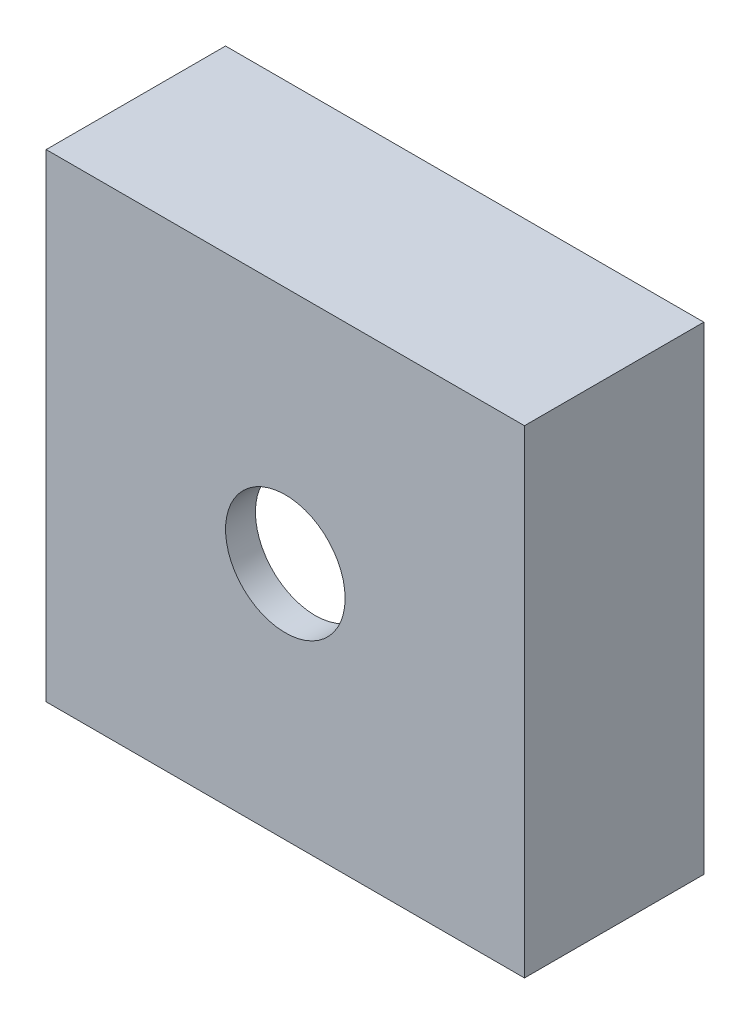
ISO-10303-21;
HEADER;
FILE_DESCRIPTION(('STEP AP214'),'2;1');
FILE_NAME('part.step','',(''),(''),'','','');
FILE_SCHEMA(('AUTOMOTIVE_DESIGN { 1 0 10303 214 1 1 1 1 }'));
ENDSEC;
DATA;
#1=APPLICATION_CONTEXT('core data for automotive mechanical design processes');
#2=APPLICATION_PROTOCOL_DEFINITION('international standard','automotive_design',2000,#1);
#3=PRODUCT_CONTEXT('',#1,'mechanical');
#4=PRODUCT('Part','Part','',(#3));
#5=PRODUCT_RELATED_PRODUCT_CATEGORY('part','',(#4));
#6=PRODUCT_DEFINITION_FORMATION('','',#4);
#7=PRODUCT_DEFINITION_CONTEXT('part definition',#1,'design');
#8=PRODUCT_DEFINITION('design','',#6,#7);
#9=PRODUCT_DEFINITION_SHAPE('','',#8);
#10=(LENGTH_UNIT() NAMED_UNIT(*) SI_UNIT(.MILLI.,.METRE.));
#11=(NAMED_UNIT(*) PLANE_ANGLE_UNIT() SI_UNIT($,.RADIAN.));
#12=(NAMED_UNIT(*) SI_UNIT($,.STERADIAN.) SOLID_ANGLE_UNIT());
#13=UNCERTAINTY_MEASURE_WITH_UNIT(LENGTH_MEASURE(1.E-05),#10,'distance_accuracy_value','');
#14=(GEOMETRIC_REPRESENTATION_CONTEXT(3) GLOBAL_UNCERTAINTY_ASSIGNED_CONTEXT((#13)) GLOBAL_UNIT_ASSIGNED_CONTEXT((#10,
#11,#12)) REPRESENTATION_CONTEXT('',''));
#15=CARTESIAN_POINT('',(0.,0.,0.));
#16=DIRECTION('',(0.,0.,1.));
#17=DIRECTION('',(1.,0.,0.));
#18=AXIS2_PLACEMENT_3D('',#15,#16,#17);
#19=CARTESIAN_POINT('',(0.,0.,0.));
#20=DIRECTION('',(0.,0.,-1.));
#21=DIRECTION('',(-1.,0.,0.));
#22=AXIS2_PLACEMENT_3D('',#19,#20,#21);
#23=PLANE('',#22);
#24=DIRECTION('',(0.,1.,0.));
#25=VECTOR('',#24,1.);
#26=CARTESIAN_POINT('',(40.,-40.,0.));
#27=LINE('',#26,#25);
#28=CARTESIAN_POINT('',(40.,-40.,0.));
#29=VERTEX_POINT('',#28);
#30=CARTESIAN_POINT('',(40.,40.,0.));
#31=VERTEX_POINT('',#30);
#32=EDGE_CURVE('E131',#29,#31,#27,.T.);
#33=ORIENTED_EDGE('',*,*,#32,.F.);
#34=DIRECTION('',(1.,0.,0.));
#35=VECTOR('',#34,1.);
#36=CARTESIAN_POINT('',(-40.,-40.,0.));
#37=LINE('',#36,#35);
#38=CARTESIAN_POINT('',(-40.,-40.,0.));
#39=VERTEX_POINT('',#38);
#40=EDGE_CURVE('E79',#39,#29,#37,.T.);
#41=ORIENTED_EDGE('',*,*,#40,.F.);
#42=DIRECTION('',(0.,-1.,0.));
#43=VECTOR('',#42,1.);
#44=CARTESIAN_POINT('',(-40.,-40.,0.));
#45=LINE('',#44,#43);
#46=CARTESIAN_POINT('',(-40.,40.,0.));
#47=VERTEX_POINT('',#46);
#48=EDGE_CURVE('E161',#47,#39,#45,.T.);
#49=ORIENTED_EDGE('',*,*,#48,.F.);
#50=DIRECTION('',(-1.,0.,0.));
#51=VECTOR('',#50,1.);
#52=CARTESIAN_POINT('',(-40.,40.,0.));
#53=LINE('',#52,#51);
#54=EDGE_CURVE('E135',#31,#47,#53,.T.);
#55=ORIENTED_EDGE('',*,*,#54,.F.);
#56=EDGE_LOOP('',(#33,#41,#49,#55));
#57=FACE_BOUND('',#56,.T.);
#58=DIRECTION('',(1.,0.,0.));
#59=VECTOR('',#58,1.);
#60=CARTESIAN_POINT('',(0.,-35.,0.));
#61=LINE('',#60,#59);
#62=CARTESIAN_POINT('',(-35.,-35.,0.));
#63=VERTEX_POINT('',#62);
#64=CARTESIAN_POINT('',(35.,-35.,0.));
#65=VERTEX_POINT('',#64);
#66=EDGE_CURVE('E126',#63,#65,#61,.T.);
#67=ORIENTED_EDGE('',*,*,#66,.T.);
#68=DIRECTION('',(0.,1.,0.));
#69=VECTOR('',#68,1.);
#70=CARTESIAN_POINT('',(35.,0.,0.));
#71=LINE('',#70,#69);
#72=CARTESIAN_POINT('',(35.,35.,0.));
#73=VERTEX_POINT('',#72);
#74=EDGE_CURVE('E147',#65,#73,#71,.T.);
#75=ORIENTED_EDGE('',*,*,#74,.T.);
#76=DIRECTION('',(-1.,0.,0.));
#77=VECTOR('',#76,1.);
#78=CARTESIAN_POINT('',(0.,35.,0.));
#79=LINE('',#78,#77);
#80=CARTESIAN_POINT('',(-35.,35.,0.));
#81=VERTEX_POINT('',#80);
#82=EDGE_CURVE('E130',#73,#81,#79,.T.);
#83=ORIENTED_EDGE('',*,*,#82,.T.);
#84=DIRECTION('',(0.,-1.,0.));
#85=VECTOR('',#84,1.);
#86=CARTESIAN_POINT('',(-35.,0.,0.));
#87=LINE('',#86,#85);
#88=EDGE_CURVE('E49',#81,#63,#87,.T.);
#89=ORIENTED_EDGE('',*,*,#88,.T.);
#90=EDGE_LOOP('',(#67,#75,#83,#89));
#91=FACE_BOUND('',#90,.T.);
#92=ADVANCED_FACE('F33',(#57,#91),#23,.T.);
#93=CARTESIAN_POINT('',(40.,-40.,30.));
#94=DIRECTION('',(-1.,0.,0.));
#95=DIRECTION('',(0.,0.,1.));
#96=AXIS2_PLACEMENT_3D('',#93,#94,#95);
#97=PLANE('',#96);
#98=ORIENTED_EDGE('',*,*,#32,.T.);
#99=DIRECTION('',(0.,0.,-1.));
#100=VECTOR('',#99,1.);
#101=CARTESIAN_POINT('',(40.,40.,30.));
#102=LINE('',#101,#100);
#103=CARTESIAN_POINT('',(40.,40.,30.));
#104=VERTEX_POINT('',#103);
#105=EDGE_CURVE('E11',#104,#31,#102,.T.);
#106=ORIENTED_EDGE('',*,*,#105,.F.);
#107=DIRECTION('',(0.,1.,0.));
#108=VECTOR('',#107,1.);
#109=CARTESIAN_POINT('',(40.,-40.,30.));
#110=LINE('',#109,#108);
#111=CARTESIAN_POINT('',(40.,-40.,30.));
#112=VERTEX_POINT('',#111);
#113=EDGE_CURVE('E153',#112,#104,#110,.T.);
#114=ORIENTED_EDGE('',*,*,#113,.F.);
#115=DIRECTION('',(0.,0.,-1.));
#116=VECTOR('',#115,1.);
#117=CARTESIAN_POINT('',(40.,-40.,30.));
#118=LINE('',#117,#116);
#119=EDGE_CURVE('E158',#112,#29,#118,.T.);
#120=ORIENTED_EDGE('',*,*,#119,.T.);
#121=EDGE_LOOP('',(#98,#106,#114,#120));
#122=FACE_BOUND('',#121,.T.);
#123=ADVANCED_FACE('F35',(#122),#97,.F.);
#124=CARTESIAN_POINT('',(-40.,40.,30.));
#125=DIRECTION('',(0.,-1.,0.));
#126=DIRECTION('',(0.,0.,-1.));
#127=AXIS2_PLACEMENT_3D('',#124,#125,#126);
#128=PLANE('',#127);
#129=ORIENTED_EDGE('',*,*,#54,.T.);
#130=DIRECTION('',(0.,0.,-1.));
#131=VECTOR('',#130,1.);
#132=CARTESIAN_POINT('',(-40.,40.,30.));
#133=LINE('',#132,#131);
#134=CARTESIAN_POINT('',(-40.,40.,30.));
#135=VERTEX_POINT('',#134);
#136=EDGE_CURVE('E42',#135,#47,#133,.T.);
#137=ORIENTED_EDGE('',*,*,#136,.F.);
#138=DIRECTION('',(-1.,0.,0.));
#139=VECTOR('',#138,1.);
#140=CARTESIAN_POINT('',(-40.,40.,30.));
#141=LINE('',#140,#139);
#142=EDGE_CURVE('E86',#104,#135,#141,.T.);
#143=ORIENTED_EDGE('',*,*,#142,.F.);
#144=ORIENTED_EDGE('',*,*,#105,.T.);
#145=EDGE_LOOP('',(#129,#137,#143,#144));
#146=FACE_BOUND('',#145,.T.);
#147=ADVANCED_FACE('F189',(#146),#128,.F.);
#148=CARTESIAN_POINT('',(-40.,-40.,30.));
#149=DIRECTION('',(1.,0.,0.));
#150=DIRECTION('',(0.,0.,-1.));
#151=AXIS2_PLACEMENT_3D('',#148,#149,#150);
#152=PLANE('',#151);
#153=ORIENTED_EDGE('',*,*,#48,.T.);
#154=DIRECTION('',(0.,0.,-1.));
#155=VECTOR('',#154,1.);
#156=CARTESIAN_POINT('',(-40.,-40.,30.));
#157=LINE('',#156,#155);
#158=CARTESIAN_POINT('',(-40.,-40.,30.));
#159=VERTEX_POINT('',#158);
#160=EDGE_CURVE('E165',#159,#39,#157,.T.);
#161=ORIENTED_EDGE('',*,*,#160,.F.);
#162=DIRECTION('',(0.,-1.,0.));
#163=VECTOR('',#162,1.);
#164=CARTESIAN_POINT('',(-40.,-40.,30.));
#165=LINE('',#164,#163);
#166=EDGE_CURVE('E156',#135,#159,#165,.T.);
#167=ORIENTED_EDGE('',*,*,#166,.F.);
#168=ORIENTED_EDGE('',*,*,#136,.T.);
#169=EDGE_LOOP('',(#153,#161,#167,#168));
#170=FACE_BOUND('',#169,.T.);
#171=ADVANCED_FACE('F171',(#170),#152,.F.);
#172=CARTESIAN_POINT('',(-40.,-40.,30.));
#173=DIRECTION('',(0.,1.,0.));
#174=DIRECTION('',(0.,0.,1.));
#175=AXIS2_PLACEMENT_3D('',#172,#173,#174);
#176=PLANE('',#175);
#177=ORIENTED_EDGE('',*,*,#40,.T.);
#178=ORIENTED_EDGE('',*,*,#119,.F.);
#179=DIRECTION('',(1.,0.,0.));
#180=VECTOR('',#179,1.);
#181=CARTESIAN_POINT('',(-40.,-40.,30.));
#182=LINE('',#181,#180);
#183=EDGE_CURVE('E58',#159,#112,#182,.T.);
#184=ORIENTED_EDGE('',*,*,#183,.F.);
#185=ORIENTED_EDGE('',*,*,#160,.T.);
#186=EDGE_LOOP('',(#177,#178,#184,#185));
#187=FACE_BOUND('',#186,.T.);
#188=ADVANCED_FACE('F179',(#187),#176,.F.);
#189=CARTESIAN_POINT('',(0.,0.,30.));
#190=DIRECTION('',(0.,0.,-1.));
#191=DIRECTION('',(-1.,0.,0.));
#192=AXIS2_PLACEMENT_3D('',#189,#190,#191);
#193=PLANE('',#192);
#194=CARTESIAN_POINT('',(0.,0.,30.));
#195=DIRECTION('',(0.,0.,1.));
#196=DIRECTION('',(1.,0.,0.));
#197=AXIS2_PLACEMENT_3D('',#194,#195,#196);
#198=CIRCLE('',#197,10.);
#199=CARTESIAN_POINT('',(10.,0.,30.));
#200=VERTEX_POINT('',#199);
#201=EDGE_CURVE('E140',#200,#200,#198,.T.);
#202=ORIENTED_EDGE('',*,*,#201,.F.);
#203=EDGE_LOOP('',(#202));
#204=FACE_BOUND('',#203,.T.);
#205=ORIENTED_EDGE('',*,*,#113,.T.);
#206=ORIENTED_EDGE('',*,*,#142,.T.);
#207=ORIENTED_EDGE('',*,*,#166,.T.);
#208=ORIENTED_EDGE('',*,*,#183,.T.);
#209=EDGE_LOOP('',(#205,#206,#207,#208));
#210=FACE_BOUND('',#209,.T.);
#211=ADVANCED_FACE('F181',(#204,#210),#193,.F.);
#212=CARTESIAN_POINT('',(35.,-40.,30.));
#213=DIRECTION('',(-1.,0.,0.));
#214=DIRECTION('',(0.,0.,1.));
#215=AXIS2_PLACEMENT_3D('',#212,#213,#214);
#216=PLANE('',#215);
#217=ORIENTED_EDGE('',*,*,#74,.F.);
#218=DIRECTION('',(0.,0.,-1.));
#219=VECTOR('',#218,1.);
#220=CARTESIAN_POINT('',(35.,-35.,30.));
#221=LINE('',#220,#219);
#222=CARTESIAN_POINT('',(35.,-35.,25.));
#223=VERTEX_POINT('',#222);
#224=EDGE_CURVE('E125',#223,#65,#221,.T.);
#225=ORIENTED_EDGE('',*,*,#224,.F.);
#226=DIRECTION('',(0.,1.,0.));
#227=VECTOR('',#226,1.);
#228=CARTESIAN_POINT('',(35.,0.,25.));
#229=LINE('',#228,#227);
#230=CARTESIAN_POINT('',(35.,35.,25.));
#231=VERTEX_POINT('',#230);
#232=EDGE_CURVE('E113',#223,#231,#229,.T.);
#233=ORIENTED_EDGE('',*,*,#232,.T.);
#234=DIRECTION('',(0.,0.,-1.));
#235=VECTOR('',#234,1.);
#236=CARTESIAN_POINT('',(35.,35.,30.));
#237=LINE('',#236,#235);
#238=EDGE_CURVE('E123',#231,#73,#237,.T.);
#239=ORIENTED_EDGE('',*,*,#238,.T.);
#240=EDGE_LOOP('',(#217,#225,#233,#239));
#241=FACE_BOUND('',#240,.T.);
#242=ADVANCED_FACE('F122',(#241),#216,.T.);
#243=CARTESIAN_POINT('',(-40.,35.,30.));
#244=DIRECTION('',(0.,-1.,0.));
#245=DIRECTION('',(0.,0.,-1.));
#246=AXIS2_PLACEMENT_3D('',#243,#244,#245);
#247=PLANE('',#246);
#248=ORIENTED_EDGE('',*,*,#82,.F.);
#249=ORIENTED_EDGE('',*,*,#238,.F.);
#250=DIRECTION('',(-1.,0.,0.));
#251=VECTOR('',#250,1.);
#252=CARTESIAN_POINT('',(0.,35.,25.));
#253=LINE('',#252,#251);
#254=CARTESIAN_POINT('',(-35.,35.,25.));
#255=VERTEX_POINT('',#254);
#256=EDGE_CURVE('E109',#231,#255,#253,.T.);
#257=ORIENTED_EDGE('',*,*,#256,.T.);
#258=DIRECTION('',(0.,0.,-1.));
#259=VECTOR('',#258,1.);
#260=CARTESIAN_POINT('',(-35.,35.,30.));
#261=LINE('',#260,#259);
#262=EDGE_CURVE('E132',#255,#81,#261,.T.);
#263=ORIENTED_EDGE('',*,*,#262,.T.);
#264=EDGE_LOOP('',(#248,#249,#257,#263));
#265=FACE_BOUND('',#264,.T.);
#266=ADVANCED_FACE('F128',(#265),#247,.T.);
#267=CARTESIAN_POINT('',(-35.,-40.,30.));
#268=DIRECTION('',(1.,0.,0.));
#269=DIRECTION('',(0.,0.,-1.));
#270=AXIS2_PLACEMENT_3D('',#267,#268,#269);
#271=PLANE('',#270);
#272=ORIENTED_EDGE('',*,*,#88,.F.);
#273=ORIENTED_EDGE('',*,*,#262,.F.);
#274=DIRECTION('',(0.,-1.,0.));
#275=VECTOR('',#274,1.);
#276=CARTESIAN_POINT('',(-35.,0.,25.));
#277=LINE('',#276,#275);
#278=CARTESIAN_POINT('',(-35.,-35.,25.));
#279=VERTEX_POINT('',#278);
#280=EDGE_CURVE('E114',#255,#279,#277,.T.);
#281=ORIENTED_EDGE('',*,*,#280,.T.);
#282=DIRECTION('',(0.,0.,-1.));
#283=VECTOR('',#282,1.);
#284=CARTESIAN_POINT('',(-35.,-35.,30.));
#285=LINE('',#284,#283);
#286=EDGE_CURVE('E137',#279,#63,#285,.T.);
#287=ORIENTED_EDGE('',*,*,#286,.T.);
#288=EDGE_LOOP('',(#272,#273,#281,#287));
#289=FACE_BOUND('',#288,.T.);
#290=ADVANCED_FACE('F204',(#289),#271,.T.);
#291=CARTESIAN_POINT('',(-40.,-35.,30.));
#292=DIRECTION('',(0.,1.,0.));
#293=DIRECTION('',(0.,0.,1.));
#294=AXIS2_PLACEMENT_3D('',#291,#292,#293);
#295=PLANE('',#294);
#296=ORIENTED_EDGE('',*,*,#66,.F.);
#297=ORIENTED_EDGE('',*,*,#286,.F.);
#298=DIRECTION('',(1.,0.,0.));
#299=VECTOR('',#298,1.);
#300=CARTESIAN_POINT('',(0.,-35.,25.));
#301=LINE('',#300,#299);
#302=EDGE_CURVE('E142',#279,#223,#301,.T.);
#303=ORIENTED_EDGE('',*,*,#302,.T.);
#304=ORIENTED_EDGE('',*,*,#224,.T.);
#305=EDGE_LOOP('',(#296,#297,#303,#304));
#306=FACE_BOUND('',#305,.T.);
#307=ADVANCED_FACE('F200',(#306),#295,.T.);
#308=CARTESIAN_POINT('',(0.,0.,25.));
#309=DIRECTION('',(0.,0.,-1.));
#310=DIRECTION('',(-1.,0.,0.));
#311=AXIS2_PLACEMENT_3D('',#308,#309,#310);
#312=PLANE('',#311);
#313=CARTESIAN_POINT('',(0.,0.,25.));
#314=DIRECTION('',(0.,0.,-1.));
#315=DIRECTION('',(-1.,0.,0.));
#316=AXIS2_PLACEMENT_3D('',#313,#314,#315);
#317=CIRCLE('',#316,10.);
#318=CARTESIAN_POINT('',(-10.,0.,25.));
#319=VERTEX_POINT('',#318);
#320=EDGE_CURVE('E37',#319,#319,#317,.T.);
#321=ORIENTED_EDGE('',*,*,#320,.F.);
#322=EDGE_LOOP('',(#321));
#323=FACE_BOUND('',#322,.T.);
#324=ORIENTED_EDGE('',*,*,#232,.F.);
#325=ORIENTED_EDGE('',*,*,#302,.F.);
#326=ORIENTED_EDGE('',*,*,#280,.F.);
#327=ORIENTED_EDGE('',*,*,#256,.F.);
#328=EDGE_LOOP('',(#324,#325,#326,#327));
#329=FACE_BOUND('',#328,.T.);
#330=ADVANCED_FACE('F111',(#323,#329),#312,.T.);
#331=CARTESIAN_POINT('',(0.,0.,20.));
#332=DIRECTION('',(0.,0.,1.));
#333=DIRECTION('',(1.,0.,0.));
#334=AXIS2_PLACEMENT_3D('',#331,#332,#333);
#335=CYLINDRICAL_SURFACE('',#334,10.);
#336=ORIENTED_EDGE('',*,*,#320,.T.);
#337=EDGE_LOOP('',(#336));
#338=FACE_BOUND('',#337,.T.);
#339=ORIENTED_EDGE('',*,*,#201,.T.);
#340=EDGE_LOOP('',(#339));
#341=FACE_BOUND('',#340,.T.);
#342=ADVANCED_FACE('F199',(#338,#341),#335,.F.);
#343=CLOSED_SHELL('',(#92,#123,#147,#171,#188,#211,#242,#266,#290,#307,#330,#342));
#344=MANIFOLD_SOLID_BREP('B2',#343);
#345=ADVANCED_BREP_SHAPE_REPRESENTATION('',(#18,#344),#14);
#346=SHAPE_DEFINITION_REPRESENTATION(#9,#345);
ENDSEC;
END-ISO-10303-21;
